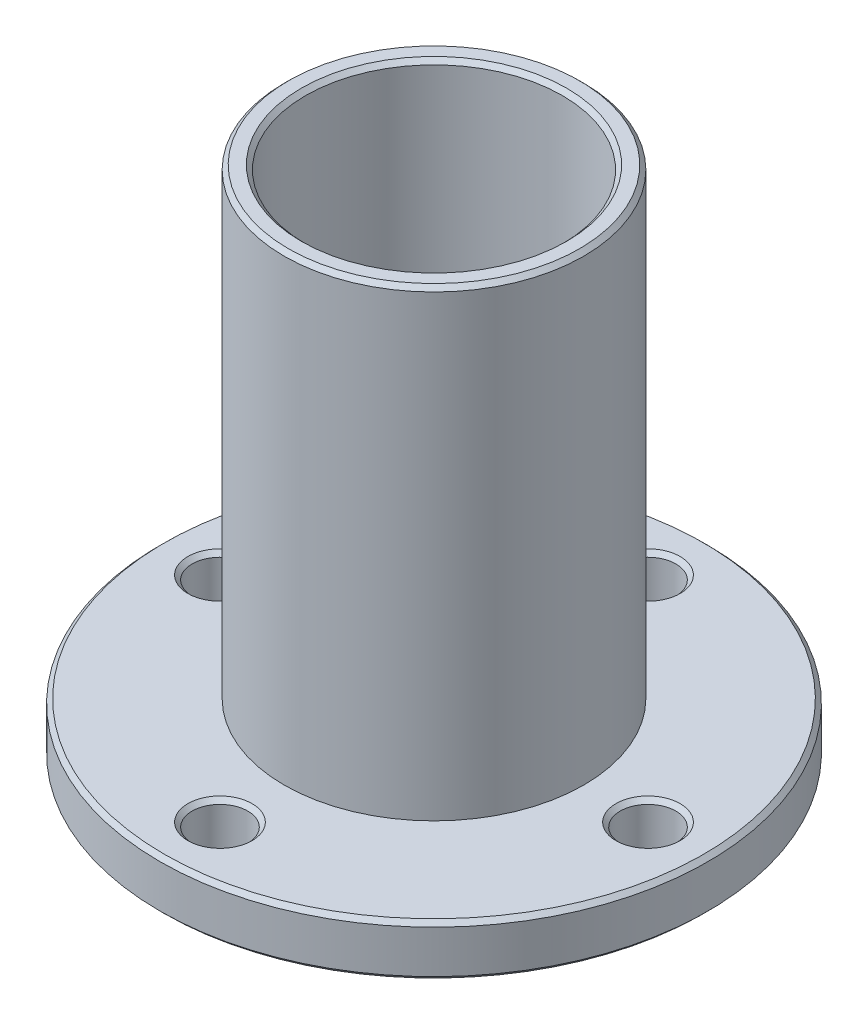
ISO-10303-21;
HEADER;
FILE_DESCRIPTION(('STEP AP214'),'2;1');
FILE_NAME('part.step','',(''),(''),'','','');
FILE_SCHEMA(('AUTOMOTIVE_DESIGN { 1 0 10303 214 1 1 1 1 }'));
ENDSEC;
DATA;
#1=APPLICATION_CONTEXT('core data for automotive mechanical design processes');
#2=APPLICATION_PROTOCOL_DEFINITION('international standard','automotive_design',2000,#1);
#3=PRODUCT_CONTEXT('',#1,'mechanical');
#4=PRODUCT('Part','Part','',(#3));
#5=PRODUCT_RELATED_PRODUCT_CATEGORY('part','',(#4));
#6=PRODUCT_DEFINITION_FORMATION('','',#4);
#7=PRODUCT_DEFINITION_CONTEXT('part definition',#1,'design');
#8=PRODUCT_DEFINITION('design','',#6,#7);
#9=PRODUCT_DEFINITION_SHAPE('','',#8);
#10=(LENGTH_UNIT() NAMED_UNIT(*) SI_UNIT(.MILLI.,.METRE.));
#11=(NAMED_UNIT(*) PLANE_ANGLE_UNIT() SI_UNIT($,.RADIAN.));
#12=(NAMED_UNIT(*) SI_UNIT($,.STERADIAN.) SOLID_ANGLE_UNIT());
#13=UNCERTAINTY_MEASURE_WITH_UNIT(LENGTH_MEASURE(1.E-05),#10,'distance_accuracy_value','');
#14=(GEOMETRIC_REPRESENTATION_CONTEXT(3) GLOBAL_UNCERTAINTY_ASSIGNED_CONTEXT((#13)) GLOBAL_UNIT_ASSIGNED_CONTEXT((#10,
#11,#12)) REPRESENTATION_CONTEXT('',''));
#15=CARTESIAN_POINT('',(0.,0.,0.));
#16=DIRECTION('',(0.,0.,1.));
#17=DIRECTION('',(1.,0.,0.));
#18=AXIS2_PLACEMENT_3D('',#15,#16,#17);
#19=CARTESIAN_POINT('',(0.,60.,0.));
#20=DIRECTION('',(0.,-1.,0.));
#21=DIRECTION('',(0.,0.,-1.));
#22=AXIS2_PLACEMENT_3D('',#19,#20,#21);
#23=CYLINDRICAL_SURFACE('',#22,32.);
#24=CARTESIAN_POINT('',(0.,5.5,0.));
#25=DIRECTION('',(0.,1.,0.));
#26=DIRECTION('',(0.,0.,1.));
#27=AXIS2_PLACEMENT_3D('',#24,#25,#26);
#28=CIRCLE('',#27,32.);
#29=CARTESIAN_POINT('',(0.,5.5,32.));
#30=VERTEX_POINT('',#29);
#31=EDGE_CURVE('E120',#30,#30,#28,.F.);
#32=ORIENTED_EDGE('',*,*,#31,.T.);
#33=EDGE_LOOP('',(#32));
#34=FACE_BOUND('',#33,.T.);
#35=CARTESIAN_POINT('',(0.,0.500000000000014,0.));
#36=DIRECTION('',(0.,1.,0.));
#37=DIRECTION('',(0.,0.,1.));
#38=AXIS2_PLACEMENT_3D('',#35,#36,#37);
#39=CIRCLE('',#38,32.);
#40=CARTESIAN_POINT('',(0.,0.500000000000014,32.));
#41=VERTEX_POINT('',#40);
#42=EDGE_CURVE('E124',#41,#41,#39,.T.);
#43=ORIENTED_EDGE('',*,*,#42,.T.);
#44=EDGE_LOOP('',(#43));
#45=FACE_BOUND('',#44,.T.);
#46=ADVANCED_FACE('F39',(#34,#45),#23,.T.);
#47=CARTESIAN_POINT('',(0.,0.,0.));
#48=DIRECTION('',(0.,1.,0.));
#49=DIRECTION('',(0.,0.,1.));
#50=AXIS2_PLACEMENT_3D('',#47,#48,#49);
#51=PLANE('',#50);
#52=CARTESIAN_POINT('',(0.,0.,-25.));
#53=DIRECTION('',(0.,1.,0.));
#54=DIRECTION('',(0.,0.,1.));
#55=AXIS2_PLACEMENT_3D('',#52,#53,#54);
#56=CIRCLE('',#55,3.75000000000002);
#57=CARTESIAN_POINT('',(0.,0.,-21.25));
#58=VERTEX_POINT('',#57);
#59=EDGE_CURVE('E64',#58,#58,#56,.T.);
#60=ORIENTED_EDGE('',*,*,#59,.T.);
#61=EDGE_LOOP('',(#60));
#62=FACE_BOUND('',#61,.T.);
#63=CARTESIAN_POINT('',(-25.,0.,0.));
#64=DIRECTION('',(0.,1.,0.));
#65=DIRECTION('',(0.,0.,1.));
#66=AXIS2_PLACEMENT_3D('',#63,#64,#65);
#67=CIRCLE('',#66,3.75000000000003);
#68=CARTESIAN_POINT('',(-25.,0.,3.75000000000003));
#69=VERTEX_POINT('',#68);
#70=EDGE_CURVE('E68',#69,#69,#67,.T.);
#71=ORIENTED_EDGE('',*,*,#70,.T.);
#72=EDGE_LOOP('',(#71));
#73=FACE_BOUND('',#72,.T.);
#74=CARTESIAN_POINT('',(0.,0.,25.));
#75=DIRECTION('',(0.,1.,0.));
#76=DIRECTION('',(0.,0.,1.));
#77=AXIS2_PLACEMENT_3D('',#74,#75,#76);
#78=CIRCLE('',#77,3.75000000000002);
#79=CARTESIAN_POINT('',(0.,0.,28.75));
#80=VERTEX_POINT('',#79);
#81=EDGE_CURVE('E72',#80,#80,#78,.T.);
#82=ORIENTED_EDGE('',*,*,#81,.T.);
#83=EDGE_LOOP('',(#82));
#84=FACE_BOUND('',#83,.T.);
#85=CARTESIAN_POINT('',(25.,0.,0.));
#86=DIRECTION('',(0.,1.,0.));
#87=DIRECTION('',(0.,0.,1.));
#88=AXIS2_PLACEMENT_3D('',#85,#86,#87);
#89=CIRCLE('',#88,3.75000000000003);
#90=CARTESIAN_POINT('',(25.,0.,3.75000000000003));
#91=VERTEX_POINT('',#90);
#92=EDGE_CURVE('E76',#91,#91,#89,.T.);
#93=ORIENTED_EDGE('',*,*,#92,.T.);
#94=EDGE_LOOP('',(#93));
#95=FACE_BOUND('',#94,.T.);
#96=CARTESIAN_POINT('',(0.,0.,0.));
#97=DIRECTION('',(0.,1.,0.));
#98=DIRECTION('',(0.,0.,1.));
#99=AXIS2_PLACEMENT_3D('',#96,#97,#98);
#100=CIRCLE('',#99,31.5);
#101=CARTESIAN_POINT('',(0.,0.,31.5));
#102=VERTEX_POINT('',#101);
#103=EDGE_CURVE('E116',#102,#102,#100,.F.);
#104=ORIENTED_EDGE('',*,*,#103,.T.);
#105=EDGE_LOOP('',(#104));
#106=FACE_BOUND('',#105,.T.);
#107=CARTESIAN_POINT('',(0.,0.,0.));
#108=DIRECTION('',(0.,-1.,0.));
#109=DIRECTION('',(0.,0.,-1.));
#110=AXIS2_PLACEMENT_3D('',#107,#108,#109);
#111=CIRCLE('',#110,20.);
#112=CARTESIAN_POINT('',(0.,0.,-20.));
#113=VERTEX_POINT('',#112);
#114=EDGE_CURVE('E157',#113,#113,#111,.T.);
#115=ORIENTED_EDGE('',*,*,#114,.F.);
#116=EDGE_LOOP('',(#115));
#117=FACE_BOUND('',#116,.T.);
#118=ADVANCED_FACE('F174',(#62,#73,#84,#95,#106,#117),#51,.F.);
#119=CARTESIAN_POINT('',(0.,6.,0.));
#120=DIRECTION('',(0.,1.,0.));
#121=DIRECTION('',(0.,0.,1.));
#122=AXIS2_PLACEMENT_3D('',#119,#120,#121);
#123=PLANE('',#122);
#124=CARTESIAN_POINT('',(0.,6.,-25.));
#125=DIRECTION('',(0.,1.,0.));
#126=DIRECTION('',(0.,0.,1.));
#127=AXIS2_PLACEMENT_3D('',#124,#125,#126);
#128=CIRCLE('',#127,3.75);
#129=CARTESIAN_POINT('',(0.,6.,-21.25));
#130=VERTEX_POINT('',#129);
#131=EDGE_CURVE('E88',#130,#130,#128,.F.);
#132=ORIENTED_EDGE('',*,*,#131,.T.);
#133=EDGE_LOOP('',(#132));
#134=FACE_BOUND('',#133,.T.);
#135=CARTESIAN_POINT('',(-25.,6.,0.));
#136=DIRECTION('',(0.,1.,0.));
#137=DIRECTION('',(0.,0.,1.));
#138=AXIS2_PLACEMENT_3D('',#135,#136,#137);
#139=CIRCLE('',#138,3.75000000000002);
#140=CARTESIAN_POINT('',(-25.,6.,3.75000000000002));
#141=VERTEX_POINT('',#140);
#142=EDGE_CURVE('E92',#141,#141,#139,.F.);
#143=ORIENTED_EDGE('',*,*,#142,.T.);
#144=EDGE_LOOP('',(#143));
#145=FACE_BOUND('',#144,.T.);
#146=CARTESIAN_POINT('',(0.,6.,25.));
#147=DIRECTION('',(0.,1.,0.));
#148=DIRECTION('',(0.,0.,1.));
#149=AXIS2_PLACEMENT_3D('',#146,#147,#148);
#150=CIRCLE('',#149,3.75);
#151=CARTESIAN_POINT('',(0.,6.,28.75));
#152=VERTEX_POINT('',#151);
#153=EDGE_CURVE('E96',#152,#152,#150,.F.);
#154=ORIENTED_EDGE('',*,*,#153,.T.);
#155=EDGE_LOOP('',(#154));
#156=FACE_BOUND('',#155,.T.);
#157=CARTESIAN_POINT('',(25.,6.,0.));
#158=DIRECTION('',(0.,1.,0.));
#159=DIRECTION('',(0.,0.,1.));
#160=AXIS2_PLACEMENT_3D('',#157,#158,#159);
#161=CIRCLE('',#160,3.75000000000002);
#162=CARTESIAN_POINT('',(25.,6.,3.75000000000002));
#163=VERTEX_POINT('',#162);
#164=EDGE_CURVE('E100',#163,#163,#161,.F.);
#165=ORIENTED_EDGE('',*,*,#164,.T.);
#166=EDGE_LOOP('',(#165));
#167=FACE_BOUND('',#166,.T.);
#168=CARTESIAN_POINT('',(0.,6.,0.));
#169=DIRECTION('',(0.,1.,0.));
#170=DIRECTION('',(0.,0.,1.));
#171=AXIS2_PLACEMENT_3D('',#168,#169,#170);
#172=CIRCLE('',#171,31.5);
#173=CARTESIAN_POINT('',(0.,6.,31.5));
#174=VERTEX_POINT('',#173);
#175=EDGE_CURVE('E128',#174,#174,#172,.T.);
#176=ORIENTED_EDGE('',*,*,#175,.T.);
#177=EDGE_LOOP('',(#176));
#178=FACE_BOUND('',#177,.T.);
#179=CARTESIAN_POINT('',(0.,6.,0.));
#180=DIRECTION('',(0.,1.,0.));
#181=DIRECTION('',(0.,0.,1.));
#182=AXIS2_PLACEMENT_3D('',#179,#180,#181);
#183=CIRCLE('',#182,17.5);
#184=CARTESIAN_POINT('',(0.,6.,17.5));
#185=VERTEX_POINT('',#184);
#186=EDGE_CURVE('E152',#185,#185,#183,.T.);
#187=ORIENTED_EDGE('',*,*,#186,.F.);
#188=EDGE_LOOP('',(#187));
#189=FACE_BOUND('',#188,.T.);
#190=ADVANCED_FACE('F176',(#134,#145,#156,#167,#178,#189),#123,.T.);
#191=CARTESIAN_POINT('',(0.,6.,0.));
#192=DIRECTION('',(0.,1.,0.));
#193=DIRECTION('',(0.,0.,1.));
#194=AXIS2_PLACEMENT_3D('',#191,#192,#193);
#195=CYLINDRICAL_SURFACE('',#194,17.5);
#196=CARTESIAN_POINT('',(0.,59.5,0.));
#197=DIRECTION('',(0.,1.,0.));
#198=DIRECTION('',(0.,0.,1.));
#199=AXIS2_PLACEMENT_3D('',#196,#197,#198);
#200=CIRCLE('',#199,17.5);
#201=CARTESIAN_POINT('',(0.,59.5,17.5));
#202=VERTEX_POINT('',#201);
#203=EDGE_CURVE('E132',#202,#202,#200,.F.);
#204=ORIENTED_EDGE('',*,*,#203,.T.);
#205=EDGE_LOOP('',(#204));
#206=FACE_BOUND('',#205,.T.);
#207=ORIENTED_EDGE('',*,*,#186,.T.);
#208=EDGE_LOOP('',(#207));
#209=FACE_BOUND('',#208,.T.);
#210=ADVANCED_FACE('F183',(#206,#209),#195,.T.);
#211=CARTESIAN_POINT('',(0.,60.,0.));
#212=DIRECTION('',(0.,1.,0.));
#213=DIRECTION('',(0.,0.,1.));
#214=AXIS2_PLACEMENT_3D('',#211,#212,#213);
#215=PLANE('',#214);
#216=CARTESIAN_POINT('',(0.,60.,0.));
#217=DIRECTION('',(0.,1.,0.));
#218=DIRECTION('',(0.,0.,1.));
#219=AXIS2_PLACEMENT_3D('',#216,#217,#218);
#220=CIRCLE('',#219,15.5);
#221=CARTESIAN_POINT('',(0.,60.,15.5));
#222=VERTEX_POINT('',#221);
#223=EDGE_CURVE('E144',#222,#222,#220,.F.);
#224=ORIENTED_EDGE('',*,*,#223,.T.);
#225=EDGE_LOOP('',(#224));
#226=FACE_BOUND('',#225,.T.);
#227=CARTESIAN_POINT('',(0.,60.,0.));
#228=DIRECTION('',(0.,1.,0.));
#229=DIRECTION('',(0.,0.,1.));
#230=AXIS2_PLACEMENT_3D('',#227,#228,#229);
#231=CIRCLE('',#230,17.);
#232=CARTESIAN_POINT('',(0.,60.,17.));
#233=VERTEX_POINT('',#232);
#234=EDGE_CURVE('E148',#233,#233,#231,.T.);
#235=ORIENTED_EDGE('',*,*,#234,.T.);
#236=EDGE_LOOP('',(#235));
#237=FACE_BOUND('',#236,.T.);
#238=ADVANCED_FACE('F170',(#226,#237),#215,.T.);
#239=CARTESIAN_POINT('',(0.,2.3,0.));
#240=DIRECTION('',(0.,-1.,0.));
#241=DIRECTION('',(0.,0.,-1.));
#242=AXIS2_PLACEMENT_3D('',#239,#240,#241);
#243=CYLINDRICAL_SURFACE('',#242,20.);
#244=CARTESIAN_POINT('',(0.,2.3,0.));
#245=DIRECTION('',(0.,-1.,0.));
#246=DIRECTION('',(0.,0.,-1.));
#247=AXIS2_PLACEMENT_3D('',#244,#245,#246);
#248=CIRCLE('',#247,20.);
#249=CARTESIAN_POINT('',(0.,2.3,-20.));
#250=VERTEX_POINT('',#249);
#251=EDGE_CURVE('E156',#250,#250,#248,.T.);
#252=ORIENTED_EDGE('',*,*,#251,.F.);
#253=EDGE_LOOP('',(#252));
#254=FACE_BOUND('',#253,.T.);
#255=ORIENTED_EDGE('',*,*,#114,.T.);
#256=EDGE_LOOP('',(#255));
#257=FACE_BOUND('',#256,.T.);
#258=ADVANCED_FACE('F167',(#254,#257),#243,.F.);
#259=CARTESIAN_POINT('',(0.,2.3,0.));
#260=DIRECTION('',(0.,-1.,0.));
#261=DIRECTION('',(0.,0.,-1.));
#262=AXIS2_PLACEMENT_3D('',#259,#260,#261);
#263=PLANE('',#262);
#264=CARTESIAN_POINT('',(0.,2.3,0.));
#265=DIRECTION('',(0.,-1.,0.));
#266=DIRECTION('',(0.,0.,-1.));
#267=AXIS2_PLACEMENT_3D('',#264,#265,#266);
#268=CIRCLE('',#267,15.5);
#269=CARTESIAN_POINT('',(0.,2.3,-15.5));
#270=VERTEX_POINT('',#269);
#271=EDGE_CURVE('E112',#270,#270,#268,.F.);
#272=ORIENTED_EDGE('',*,*,#271,.T.);
#273=EDGE_LOOP('',(#272));
#274=FACE_BOUND('',#273,.T.);
#275=ORIENTED_EDGE('',*,*,#251,.T.);
#276=EDGE_LOOP('',(#275));
#277=FACE_BOUND('',#276,.T.);
#278=ADVANCED_FACE('F165',(#274,#277),#263,.T.);
#279=CARTESIAN_POINT('',(0.,60.,0.));
#280=DIRECTION('',(0.,-1.,0.));
#281=DIRECTION('',(0.,0.,-1.));
#282=AXIS2_PLACEMENT_3D('',#279,#280,#281);
#283=CYLINDRICAL_SURFACE('',#282,15.);
#284=CARTESIAN_POINT('',(0.,59.5,0.));
#285=DIRECTION('',(0.,1.,0.));
#286=DIRECTION('',(0.,0.,1.));
#287=AXIS2_PLACEMENT_3D('',#284,#285,#286);
#288=CIRCLE('',#287,15.);
#289=CARTESIAN_POINT('',(0.,59.5,15.));
#290=VERTEX_POINT('',#289);
#291=EDGE_CURVE('E136',#290,#290,#288,.T.);
#292=ORIENTED_EDGE('',*,*,#291,.T.);
#293=EDGE_LOOP('',(#292));
#294=FACE_BOUND('',#293,.T.);
#295=CARTESIAN_POINT('',(0.,2.79999999999998,0.));
#296=DIRECTION('',(0.,-1.,0.));
#297=DIRECTION('',(0.,0.,-1.));
#298=AXIS2_PLACEMENT_3D('',#295,#296,#297);
#299=CIRCLE('',#298,15.);
#300=CARTESIAN_POINT('',(0.,2.79999999999998,-15.));
#301=VERTEX_POINT('',#300);
#302=EDGE_CURVE('E140',#301,#301,#299,.T.);
#303=ORIENTED_EDGE('',*,*,#302,.T.);
#304=EDGE_LOOP('',(#303));
#305=FACE_BOUND('',#304,.T.);
#306=ADVANCED_FACE('F200',(#294,#305),#283,.F.);
#307=CARTESIAN_POINT('',(0.,60.,0.));
#308=DIRECTION('',(0.,1.,0.));
#309=DIRECTION('',(0.,0.,1.));
#310=AXIS2_PLACEMENT_3D('',#307,#308,#309);
#311=CONICAL_SURFACE('',#310,15.5,0.785398163397447);
#312=ORIENTED_EDGE('',*,*,#291,.F.);
#313=EDGE_LOOP('',(#312));
#314=FACE_BOUND('',#313,.T.);
#315=ORIENTED_EDGE('',*,*,#223,.F.);
#316=EDGE_LOOP('',(#315));
#317=FACE_BOUND('',#316,.T.);
#318=ADVANCED_FACE('F193',(#314,#317),#311,.F.);
#319=CARTESIAN_POINT('',(0.,60.,0.));
#320=DIRECTION('',(0.,-1.,0.));
#321=DIRECTION('',(0.,0.,-1.));
#322=AXIS2_PLACEMENT_3D('',#319,#320,#321);
#323=CONICAL_SURFACE('',#322,17.,0.785398163397438);
#324=ORIENTED_EDGE('',*,*,#203,.F.);
#325=EDGE_LOOP('',(#324));
#326=FACE_BOUND('',#325,.T.);
#327=ORIENTED_EDGE('',*,*,#234,.F.);
#328=EDGE_LOOP('',(#327));
#329=FACE_BOUND('',#328,.T.);
#330=ADVANCED_FACE('F199',(#326,#329),#323,.T.);
#331=CARTESIAN_POINT('',(0.,6.,0.));
#332=DIRECTION('',(0.,-1.,0.));
#333=DIRECTION('',(0.,0.,-1.));
#334=AXIS2_PLACEMENT_3D('',#331,#332,#333);
#335=CONICAL_SURFACE('',#334,31.5,0.785398163397462);
#336=ORIENTED_EDGE('',*,*,#31,.F.);
#337=EDGE_LOOP('',(#336));
#338=FACE_BOUND('',#337,.T.);
#339=ORIENTED_EDGE('',*,*,#175,.F.);
#340=EDGE_LOOP('',(#339));
#341=FACE_BOUND('',#340,.T.);
#342=ADVANCED_FACE('F207',(#338,#341),#335,.T.);
#343=CARTESIAN_POINT('',(0.,0.500000000000014,0.));
#344=DIRECTION('',(0.,1.,0.));
#345=DIRECTION('',(0.,0.,1.));
#346=AXIS2_PLACEMENT_3D('',#343,#344,#345);
#347=CONICAL_SURFACE('',#346,32.,0.785398163397448);
#348=ORIENTED_EDGE('',*,*,#103,.F.);
#349=EDGE_LOOP('',(#348));
#350=FACE_BOUND('',#349,.T.);
#351=ORIENTED_EDGE('',*,*,#42,.F.);
#352=EDGE_LOOP('',(#351));
#353=FACE_BOUND('',#352,.T.);
#354=ADVANCED_FACE('F214',(#350,#353),#347,.T.);
#355=CARTESIAN_POINT('',(0.,2.79999999999998,0.));
#356=DIRECTION('',(0.,-1.,0.));
#357=DIRECTION('',(0.,0.,-1.));
#358=AXIS2_PLACEMENT_3D('',#355,#356,#357);
#359=CONICAL_SURFACE('',#358,15.,0.78539816339745);
#360=ORIENTED_EDGE('',*,*,#271,.F.);
#361=EDGE_LOOP('',(#360));
#362=FACE_BOUND('',#361,.T.);
#363=ORIENTED_EDGE('',*,*,#302,.F.);
#364=EDGE_LOOP('',(#363));
#365=FACE_BOUND('',#364,.T.);
#366=ADVANCED_FACE('F221',(#362,#365),#359,.F.);
#367=CARTESIAN_POINT('',(0.,60.,25.));
#368=DIRECTION('',(0.,-1.,0.));
#369=DIRECTION('',(0.,0.,-1.));
#370=AXIS2_PLACEMENT_3D('',#367,#368,#369);
#371=CYLINDRICAL_SURFACE('',#370,3.25);
#372=CARTESIAN_POINT('',(0.,0.500000000000014,25.));
#373=DIRECTION('',(0.,1.,0.));
#374=DIRECTION('',(0.,0.,1.));
#375=AXIS2_PLACEMENT_3D('',#372,#373,#374);
#376=CIRCLE('',#375,3.25);
#377=CARTESIAN_POINT('',(0.,0.500000000000014,28.25));
#378=VERTEX_POINT('',#377);
#379=EDGE_CURVE('E53',#378,#378,#376,.F.);
#380=ORIENTED_EDGE('',*,*,#379,.T.);
#381=EDGE_LOOP('',(#380));
#382=FACE_BOUND('',#381,.T.);
#383=CARTESIAN_POINT('',(0.,5.5,25.));
#384=DIRECTION('',(0.,1.,0.));
#385=DIRECTION('',(0.,0.,1.));
#386=AXIS2_PLACEMENT_3D('',#383,#384,#385);
#387=CIRCLE('',#386,3.25);
#388=CARTESIAN_POINT('',(0.,5.5,28.25));
#389=VERTEX_POINT('',#388);
#390=EDGE_CURVE('E58',#389,#389,#387,.T.);
#391=ORIENTED_EDGE('',*,*,#390,.T.);
#392=EDGE_LOOP('',(#391));
#393=FACE_BOUND('',#392,.T.);
#394=ADVANCED_FACE('F228',(#382,#393),#371,.F.);
#395=CARTESIAN_POINT('',(-25.,60.,0.));
#396=DIRECTION('',(0.,-1.,0.));
#397=DIRECTION('',(0.,0.,-1.));
#398=AXIS2_PLACEMENT_3D('',#395,#396,#397);
#399=CYLINDRICAL_SURFACE('',#398,3.25);
#400=CARTESIAN_POINT('',(-25.,5.49999999999998,0.));
#401=DIRECTION('',(0.,1.,0.));
#402=DIRECTION('',(0.,0.,1.));
#403=AXIS2_PLACEMENT_3D('',#400,#401,#402);
#404=CIRCLE('',#403,3.25);
#405=CARTESIAN_POINT('',(-25.,5.49999999999998,3.25));
#406=VERTEX_POINT('',#405);
#407=EDGE_CURVE('E80',#406,#406,#404,.T.);
#408=ORIENTED_EDGE('',*,*,#407,.T.);
#409=EDGE_LOOP('',(#408));
#410=FACE_BOUND('',#409,.T.);
#411=CARTESIAN_POINT('',(-25.,0.500000000000028,0.));
#412=DIRECTION('',(0.,1.,0.));
#413=DIRECTION('',(0.,0.,1.));
#414=AXIS2_PLACEMENT_3D('',#411,#412,#413);
#415=CIRCLE('',#414,3.25);
#416=CARTESIAN_POINT('',(-25.,0.500000000000028,3.25));
#417=VERTEX_POINT('',#416);
#418=EDGE_CURVE('E84',#417,#417,#415,.F.);
#419=ORIENTED_EDGE('',*,*,#418,.T.);
#420=EDGE_LOOP('',(#419));
#421=FACE_BOUND('',#420,.T.);
#422=ADVANCED_FACE('F305',(#410,#421),#399,.F.);
#423=CARTESIAN_POINT('',(0.,60.,-25.));
#424=DIRECTION('',(0.,-1.,0.));
#425=DIRECTION('',(0.,0.,-1.));
#426=AXIS2_PLACEMENT_3D('',#423,#424,#425);
#427=CYLINDRICAL_SURFACE('',#426,3.25);
#428=CARTESIAN_POINT('',(0.,5.5,-25.));
#429=DIRECTION('',(0.,1.,0.));
#430=DIRECTION('',(0.,0.,1.));
#431=AXIS2_PLACEMENT_3D('',#428,#429,#430);
#432=CIRCLE('',#431,3.25);
#433=CARTESIAN_POINT('',(0.,5.5,-21.75));
#434=VERTEX_POINT('',#433);
#435=EDGE_CURVE('E104',#434,#434,#432,.T.);
#436=ORIENTED_EDGE('',*,*,#435,.T.);
#437=EDGE_LOOP('',(#436));
#438=FACE_BOUND('',#437,.T.);
#439=CARTESIAN_POINT('',(0.,0.500000000000014,-25.));
#440=DIRECTION('',(0.,1.,0.));
#441=DIRECTION('',(0.,0.,1.));
#442=AXIS2_PLACEMENT_3D('',#439,#440,#441);
#443=CIRCLE('',#442,3.25);
#444=CARTESIAN_POINT('',(0.,0.500000000000014,-21.75));
#445=VERTEX_POINT('',#444);
#446=EDGE_CURVE('E108',#445,#445,#443,.F.);
#447=ORIENTED_EDGE('',*,*,#446,.T.);
#448=EDGE_LOOP('',(#447));
#449=FACE_BOUND('',#448,.T.);
#450=ADVANCED_FACE('F309',(#438,#449),#427,.F.);
#451=CARTESIAN_POINT('',(25.,60.,0.));
#452=DIRECTION('',(0.,-1.,0.));
#453=DIRECTION('',(0.,0.,-1.));
#454=AXIS2_PLACEMENT_3D('',#451,#452,#453);
#455=CYLINDRICAL_SURFACE('',#454,3.25);
#456=CARTESIAN_POINT('',(25.,5.49999999999998,0.));
#457=DIRECTION('',(0.,1.,0.));
#458=DIRECTION('',(0.,0.,1.));
#459=AXIS2_PLACEMENT_3D('',#456,#457,#458);
#460=CIRCLE('',#459,3.25);
#461=CARTESIAN_POINT('',(25.,5.49999999999998,3.25));
#462=VERTEX_POINT('',#461);
#463=EDGE_CURVE('E11',#462,#462,#460,.T.);
#464=ORIENTED_EDGE('',*,*,#463,.T.);
#465=EDGE_LOOP('',(#464));
#466=FACE_BOUND('',#465,.T.);
#467=CARTESIAN_POINT('',(25.,0.500000000000028,0.));
#468=DIRECTION('',(0.,1.,0.));
#469=DIRECTION('',(0.,0.,1.));
#470=AXIS2_PLACEMENT_3D('',#467,#468,#469);
#471=CIRCLE('',#470,3.25);
#472=CARTESIAN_POINT('',(25.,0.500000000000028,3.25));
#473=VERTEX_POINT('',#472);
#474=EDGE_CURVE('E48',#473,#473,#471,.F.);
#475=ORIENTED_EDGE('',*,*,#474,.T.);
#476=EDGE_LOOP('',(#475));
#477=FACE_BOUND('',#476,.T.);
#478=ADVANCED_FACE('F237',(#466,#477),#455,.F.);
#479=CARTESIAN_POINT('',(0.,5.5,-25.));
#480=DIRECTION('',(0.,1.,0.));
#481=DIRECTION('',(0.,0.,1.));
#482=AXIS2_PLACEMENT_3D('',#479,#480,#481);
#483=CONICAL_SURFACE('',#482,3.25,0.785398163397451);
#484=ORIENTED_EDGE('',*,*,#131,.F.);
#485=EDGE_LOOP('',(#484));
#486=FACE_BOUND('',#485,.T.);
#487=ORIENTED_EDGE('',*,*,#435,.F.);
#488=EDGE_LOOP('',(#487));
#489=FACE_BOUND('',#488,.T.);
#490=ADVANCED_FACE('F230',(#486,#489),#483,.F.);
#491=CARTESIAN_POINT('',(-25.,5.49999999999998,0.));
#492=DIRECTION('',(0.,1.,0.));
#493=DIRECTION('',(0.,0.,1.));
#494=AXIS2_PLACEMENT_3D('',#491,#492,#493);
#495=CONICAL_SURFACE('',#494,3.25,0.785398163397451);
#496=ORIENTED_EDGE('',*,*,#142,.F.);
#497=EDGE_LOOP('',(#496));
#498=FACE_BOUND('',#497,.T.);
#499=ORIENTED_EDGE('',*,*,#407,.F.);
#500=EDGE_LOOP('',(#499));
#501=FACE_BOUND('',#500,.T.);
#502=ADVANCED_FACE('F236',(#498,#501),#495,.F.);
#503=CARTESIAN_POINT('',(0.,0.500000000000014,-25.));
#504=DIRECTION('',(0.,-1.,0.));
#505=DIRECTION('',(0.,0.,-1.));
#506=AXIS2_PLACEMENT_3D('',#503,#504,#505);
#507=CONICAL_SURFACE('',#506,3.25,0.785398163397451);
#508=ORIENTED_EDGE('',*,*,#59,.F.);
#509=EDGE_LOOP('',(#508));
#510=FACE_BOUND('',#509,.T.);
#511=ORIENTED_EDGE('',*,*,#446,.F.);
#512=EDGE_LOOP('',(#511));
#513=FACE_BOUND('',#512,.T.);
#514=ADVANCED_FACE('F244',(#510,#513),#507,.F.);
#515=CARTESIAN_POINT('',(-25.,0.500000000000028,0.));
#516=DIRECTION('',(0.,-1.,0.));
#517=DIRECTION('',(0.,0.,-1.));
#518=AXIS2_PLACEMENT_3D('',#515,#516,#517);
#519=CONICAL_SURFACE('',#518,3.25,0.785398163397451);
#520=ORIENTED_EDGE('',*,*,#70,.F.);
#521=EDGE_LOOP('',(#520));
#522=FACE_BOUND('',#521,.T.);
#523=ORIENTED_EDGE('',*,*,#418,.F.);
#524=EDGE_LOOP('',(#523));
#525=FACE_BOUND('',#524,.T.);
#526=ADVANCED_FACE('F251',(#522,#525),#519,.F.);
#527=CARTESIAN_POINT('',(0.,0.500000000000014,25.));
#528=DIRECTION('',(0.,-1.,0.));
#529=DIRECTION('',(0.,0.,-1.));
#530=AXIS2_PLACEMENT_3D('',#527,#528,#529);
#531=CONICAL_SURFACE('',#530,3.25,0.785398163397451);
#532=ORIENTED_EDGE('',*,*,#81,.F.);
#533=EDGE_LOOP('',(#532));
#534=FACE_BOUND('',#533,.T.);
#535=ORIENTED_EDGE('',*,*,#379,.F.);
#536=EDGE_LOOP('',(#535));
#537=FACE_BOUND('',#536,.T.);
#538=ADVANCED_FACE('F258',(#534,#537),#531,.F.);
#539=CARTESIAN_POINT('',(0.,5.5,25.));
#540=DIRECTION('',(0.,1.,0.));
#541=DIRECTION('',(0.,0.,1.));
#542=AXIS2_PLACEMENT_3D('',#539,#540,#541);
#543=CONICAL_SURFACE('',#542,3.25,0.785398163397451);
#544=ORIENTED_EDGE('',*,*,#153,.F.);
#545=EDGE_LOOP('',(#544));
#546=FACE_BOUND('',#545,.T.);
#547=ORIENTED_EDGE('',*,*,#390,.F.);
#548=EDGE_LOOP('',(#547));
#549=FACE_BOUND('',#548,.T.);
#550=ADVANCED_FACE('F265',(#546,#549),#543,.F.);
#551=CARTESIAN_POINT('',(25.,5.49999999999998,0.));
#552=DIRECTION('',(0.,1.,0.));
#553=DIRECTION('',(0.,0.,1.));
#554=AXIS2_PLACEMENT_3D('',#551,#552,#553);
#555=CONICAL_SURFACE('',#554,3.25,0.785398163397451);
#556=ORIENTED_EDGE('',*,*,#164,.F.);
#557=EDGE_LOOP('',(#556));
#558=FACE_BOUND('',#557,.T.);
#559=ORIENTED_EDGE('',*,*,#463,.F.);
#560=EDGE_LOOP('',(#559));
#561=FACE_BOUND('',#560,.T.);
#562=ADVANCED_FACE('F271',(#558,#561),#555,.F.);
#563=CARTESIAN_POINT('',(25.,0.500000000000028,0.));
#564=DIRECTION('',(0.,-1.,0.));
#565=DIRECTION('',(0.,0.,-1.));
#566=AXIS2_PLACEMENT_3D('',#563,#564,#565);
#567=CONICAL_SURFACE('',#566,3.25,0.785398163397451);
#568=ORIENTED_EDGE('',*,*,#92,.F.);
#569=EDGE_LOOP('',(#568));
#570=FACE_BOUND('',#569,.T.);
#571=ORIENTED_EDGE('',*,*,#474,.F.);
#572=EDGE_LOOP('',(#571));
#573=FACE_BOUND('',#572,.T.);
#574=ADVANCED_FACE('F42',(#570,#573),#567,.F.);
#575=CLOSED_SHELL('',(#46,#118,#190,#210,#238,#258,#278,#306,#318,#330,#342,#354,#366,#394,#422,
#450,#478,#490,#502,#514,#526,#538,#550,#562,#574));
#576=MANIFOLD_SOLID_BREP('B2',#575);
#577=ADVANCED_BREP_SHAPE_REPRESENTATION('',(#18,#576),#14);
#578=SHAPE_DEFINITION_REPRESENTATION(#9,#577);
ENDSEC;
END-ISO-10303-21;
